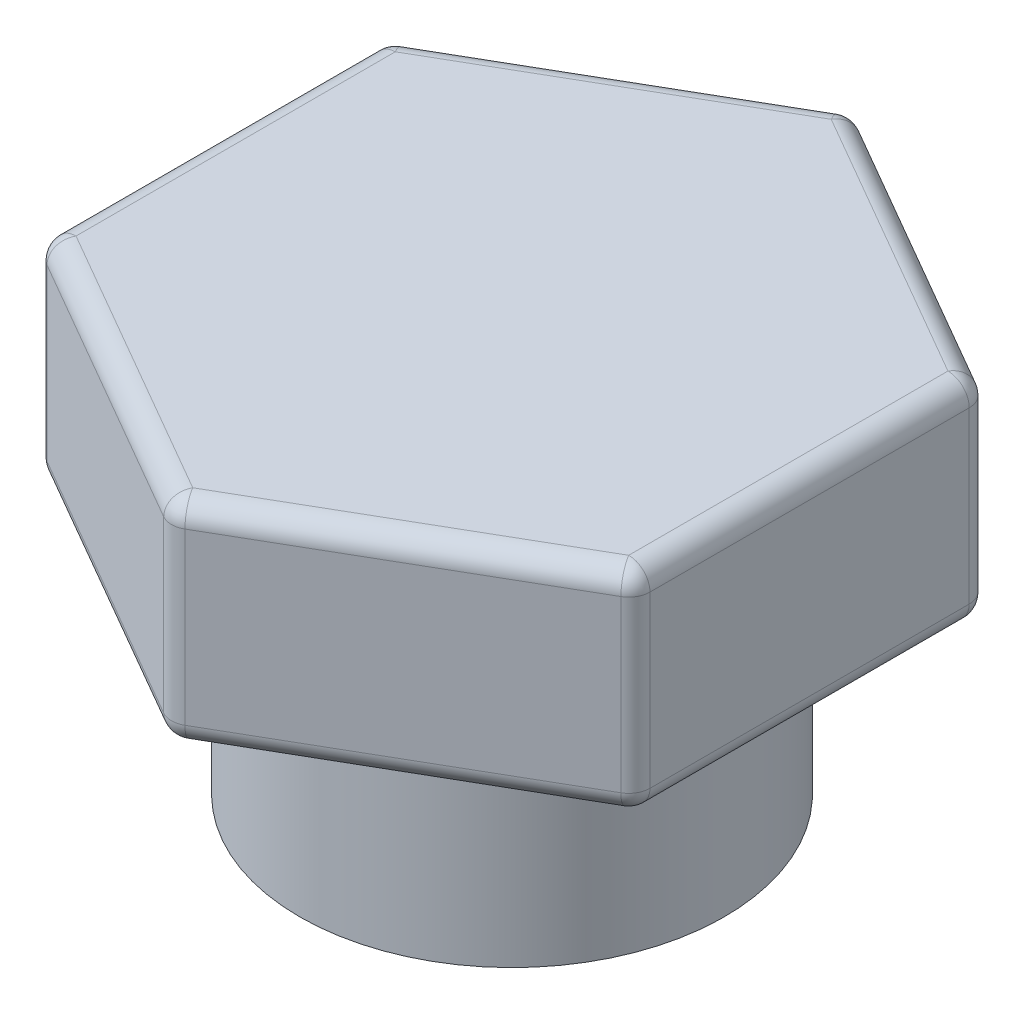
ISO-10303-21;
HEADER;
FILE_DESCRIPTION(('STEP AP214'),'2;1');
FILE_NAME('part.step','',(''),(''),'','','');
FILE_SCHEMA(('AUTOMOTIVE_DESIGN { 1 0 10303 214 1 1 1 1 }'));
ENDSEC;
DATA;
#1=APPLICATION_CONTEXT('core data for automotive mechanical design processes');
#2=APPLICATION_PROTOCOL_DEFINITION('international standard','automotive_design',2000,#1);
#3=PRODUCT_CONTEXT('',#1,'mechanical');
#4=PRODUCT('Part','Part','',(#3));
#5=PRODUCT_RELATED_PRODUCT_CATEGORY('part','',(#4));
#6=PRODUCT_DEFINITION_FORMATION('','',#4);
#7=PRODUCT_DEFINITION_CONTEXT('part definition',#1,'design');
#8=PRODUCT_DEFINITION('design','',#6,#7);
#9=PRODUCT_DEFINITION_SHAPE('','',#8);
#10=(LENGTH_UNIT() NAMED_UNIT(*) SI_UNIT(.MILLI.,.METRE.));
#11=(NAMED_UNIT(*) PLANE_ANGLE_UNIT() SI_UNIT($,.RADIAN.));
#12=(NAMED_UNIT(*) SI_UNIT($,.STERADIAN.) SOLID_ANGLE_UNIT());
#13=UNCERTAINTY_MEASURE_WITH_UNIT(LENGTH_MEASURE(1.E-05),#10,'distance_accuracy_value','');
#14=(GEOMETRIC_REPRESENTATION_CONTEXT(3) GLOBAL_UNCERTAINTY_ASSIGNED_CONTEXT((#13)) GLOBAL_UNIT_ASSIGNED_CONTEXT((#10,
#11,#12)) REPRESENTATION_CONTEXT('',''));
#15=CARTESIAN_POINT('',(0.,0.,0.));
#16=DIRECTION('',(0.,0.,1.));
#17=DIRECTION('',(1.,0.,0.));
#18=AXIS2_PLACEMENT_3D('',#15,#16,#17);
#19=CARTESIAN_POINT('',(0.,5.,0.));
#20=DIRECTION('',(0.,-1.,0.));
#21=DIRECTION('',(0.,0.,-1.));
#22=AXIS2_PLACEMENT_3D('',#19,#20,#21);
#23=CYLINDRICAL_SURFACE('',#22,5.);
#24=CARTESIAN_POINT('',(0.,5.,0.));
#25=DIRECTION('',(0.,1.,0.));
#26=DIRECTION('',(0.,0.,1.));
#27=AXIS2_PLACEMENT_3D('',#24,#25,#26);
#28=CIRCLE('',#27,5.);
#29=CARTESIAN_POINT('',(0.,5.,5.));
#30=VERTEX_POINT('',#29);
#31=EDGE_CURVE('E195',#30,#30,#28,.T.);
#32=ORIENTED_EDGE('',*,*,#31,.F.);
#33=EDGE_LOOP('',(#32));
#34=FACE_BOUND('',#33,.T.);
#35=CARTESIAN_POINT('',(0.,0.,0.));
#36=DIRECTION('',(0.,1.,0.));
#37=DIRECTION('',(0.,0.,1.));
#38=AXIS2_PLACEMENT_3D('',#35,#36,#37);
#39=CIRCLE('',#38,5.);
#40=CARTESIAN_POINT('',(0.,0.,5.));
#41=VERTEX_POINT('',#40);
#42=EDGE_CURVE('E352',#41,#41,#39,.T.);
#43=ORIENTED_EDGE('',*,*,#42,.T.);
#44=EDGE_LOOP('',(#43));
#45=FACE_BOUND('',#44,.T.);
#46=ADVANCED_FACE('F39',(#34,#45),#23,.T.);
#47=CARTESIAN_POINT('',(0.,0.,0.));
#48=DIRECTION('',(0.,1.,0.));
#49=DIRECTION('',(0.,0.,1.));
#50=AXIS2_PLACEMENT_3D('',#47,#48,#49);
#51=PLANE('',#50);
#52=ORIENTED_EDGE('',*,*,#42,.F.);
#53=EDGE_LOOP('',(#52));
#54=FACE_BOUND('',#53,.T.);
#55=ADVANCED_FACE('F452',(#54),#51,.F.);
#56=CARTESIAN_POINT('',(-0.00203099074300272,10.,8.0890769934766));
#57=DIRECTION('',(-0.499782544163119,0.,-0.866150915574093));
#58=DIRECTION('',(-0.866150915574093,0.,0.499782544163119));
#59=AXIS2_PLACEMENT_3D('',#56,#57,#58);
#60=PLANE('',#59);
#61=DIRECTION('',(0.,-1.,0.));
#62=VECTOR('',#61,1.);
#63=CARTESIAN_POINT('',(6.75429444201471,10.,4.19057217952102));
#64=LINE('',#63,#62);
#65=CARTESIAN_POINT('',(6.75429444201471,5.5,4.19057217952102));
#66=VERTEX_POINT('',#65);
#67=CARTESIAN_POINT('',(6.75429444201471,9.5,4.19057217952102));
#68=VERTEX_POINT('',#67);
#69=EDGE_CURVE('E227',#66,#68,#64,.F.);
#70=ORIENTED_EDGE('',*,*,#69,.T.);
#71=DIRECTION('',(0.866150915574093,0.,-0.499782544163119));
#72=VECTOR('',#71,1.);
#73=CARTESIAN_POINT('',(-0.00203099074300331,9.5,8.0890769934766));
#74=LINE('',#73,#72);
#75=CARTESIAN_POINT('',(0.24800524138977,9.5,7.94480220027217));
#76=VERTEX_POINT('',#75);
#77=EDGE_CURVE('E226',#68,#76,#74,.F.);
#78=ORIENTED_EDGE('',*,*,#77,.T.);
#79=DIRECTION('',(0.,-1.,0.));
#80=VECTOR('',#79,1.);
#81=CARTESIAN_POINT('',(0.24800524138977,10.,7.94480220027217));
#82=LINE('',#81,#80);
#83=CARTESIAN_POINT('',(0.24800524138977,5.5,7.94480220027217));
#84=VERTEX_POINT('',#83);
#85=EDGE_CURVE('E221',#76,#84,#82,.T.);
#86=ORIENTED_EDGE('',*,*,#85,.T.);
#87=DIRECTION('',(0.866150915574093,0.,-0.499782544163119));
#88=VECTOR('',#87,1.);
#89=CARTESIAN_POINT('',(-0.00203099074300272,5.5,8.0890769934766));
#90=LINE('',#89,#88);
#91=EDGE_CURVE('E228',#84,#66,#90,.T.);
#92=ORIENTED_EDGE('',*,*,#91,.T.);
#93=EDGE_LOOP('',(#70,#78,#86,#92));
#94=FACE_BOUND('',#93,.T.);
#95=ADVANCED_FACE('F458',(#94),#60,.F.);
#96=CARTESIAN_POINT('',(7.00433067414748,10.,4.04629738631659));
#97=DIRECTION('',(-0.999999968479875,0.,-0.000251078173767648));
#98=DIRECTION('',(-0.000251078173767648,0.,0.999999968479875));
#99=AXIS2_PLACEMENT_3D('',#96,#97,#98);
#100=PLANE('',#99);
#101=DIRECTION('',(0.000251078173767648,0.,-0.999999968479875));
#102=VECTOR('',#101,1.);
#103=CARTESIAN_POINT('',(7.00433067414748,9.5,4.04629738631659));
#104=LINE('',#103,#102);
#105=CARTESIAN_POINT('',(7.00628918486488,9.5,-3.75410448166427));
#106=VERTEX_POINT('',#105);
#107=CARTESIAN_POINT('',(7.00440315417309,9.5,3.75762226082086));
#108=VERTEX_POINT('',#107);
#109=EDGE_CURVE('E173',#106,#108,#104,.F.);
#110=ORIENTED_EDGE('',*,*,#109,.T.);
#111=DIRECTION('',(0.,-1.,0.));
#112=VECTOR('',#111,1.);
#113=CARTESIAN_POINT('',(7.00440315417309,10.,3.75762226082086));
#114=LINE('',#113,#112);
#115=CARTESIAN_POINT('',(7.00440315417309,5.5,3.75762226082086));
#116=VERTEX_POINT('',#115);
#117=EDGE_CURVE('E207',#108,#116,#114,.T.);
#118=ORIENTED_EDGE('',*,*,#117,.T.);
#119=DIRECTION('',(0.000251078173767648,0.,-0.999999968479875));
#120=VECTOR('',#119,1.);
#121=CARTESIAN_POINT('',(7.00433067414748,5.5,4.04629738631659));
#122=LINE('',#121,#120);
#123=CARTESIAN_POINT('',(7.00628918486488,5.5,-3.75410448166427));
#124=VERTEX_POINT('',#123);
#125=EDGE_CURVE('E203',#116,#124,#122,.T.);
#126=ORIENTED_EDGE('',*,*,#125,.T.);
#127=DIRECTION('',(0.,-1.,0.));
#128=VECTOR('',#127,1.);
#129=CARTESIAN_POINT('',(7.00628918486488,10.,-3.75410448166427));
#130=LINE('',#129,#128);
#131=EDGE_CURVE('E200',#124,#106,#130,.F.);
#132=ORIENTED_EDGE('',*,*,#131,.T.);
#133=EDGE_LOOP('',(#110,#118,#126,#132));
#134=FACE_BOUND('',#133,.T.);
#135=ADVANCED_FACE('F392',(#134),#100,.F.);
#136=CARTESIAN_POINT('',(7.00636166489049,10.,-4.04277960716));
#137=DIRECTION('',(-0.500217424316756,0.,0.865899837400326));
#138=DIRECTION('',(0.865899837400326,0.,0.500217424316756));
#139=AXIS2_PLACEMENT_3D('',#136,#137,#138);
#140=PLANE('',#139);
#141=DIRECTION('',(-0.865899837400326,0.,-0.500217424316756));
#142=VECTOR('',#141,1.);
#143=CARTESIAN_POINT('',(7.00636166489049,9.5,-4.04277960716));
#144=LINE('',#143,#142);
#145=CARTESIAN_POINT('',(0.251994742850171,9.5,-7.94467666118529));
#146=VERTEX_POINT('',#145);
#147=CARTESIAN_POINT('',(6.75639791278332,9.5,-4.18717993945131));
#148=VERTEX_POINT('',#147);
#149=EDGE_CURVE('E48',#146,#148,#144,.F.);
#150=ORIENTED_EDGE('',*,*,#149,.T.);
#151=DIRECTION('',(0.,-1.,0.));
#152=VECTOR('',#151,1.);
#153=CARTESIAN_POINT('',(6.75639791278332,10.,-4.18717993945131));
#154=LINE('',#153,#152);
#155=CARTESIAN_POINT('',(6.75639791278332,5.5,-4.18717993945131));
#156=VERTEX_POINT('',#155);
#157=EDGE_CURVE('E11',#148,#156,#154,.T.);
#158=ORIENTED_EDGE('',*,*,#157,.T.);
#159=DIRECTION('',(-0.865899837400326,0.,-0.500217424316756));
#160=VECTOR('',#159,1.);
#161=CARTESIAN_POINT('',(7.00636166489049,5.5,-4.04277960716));
#162=LINE('',#161,#160);
#163=CARTESIAN_POINT('',(0.251994742850171,5.5,-7.94467666118529));
#164=VERTEX_POINT('',#163);
#165=EDGE_CURVE('E257',#156,#164,#162,.T.);
#166=ORIENTED_EDGE('',*,*,#165,.T.);
#167=DIRECTION('',(0.,-1.,0.));
#168=VECTOR('',#167,1.);
#169=CARTESIAN_POINT('',(0.25199474285017,10.,-7.94467666118529));
#170=LINE('',#169,#168);
#171=EDGE_CURVE('E56',#164,#146,#170,.F.);
#172=ORIENTED_EDGE('',*,*,#171,.T.);
#173=EDGE_LOOP('',(#150,#158,#166,#172));
#174=FACE_BOUND('',#173,.T.);
#175=ADVANCED_FACE('F397',(#174),#140,.F.);
#176=CARTESIAN_POINT('',(0.00203099074300591,10.,-8.0890769934766));
#177=DIRECTION('',(0.499782544163119,0.,0.866150915574094));
#178=DIRECTION('',(0.866150915574094,0.,-0.499782544163119));
#179=AXIS2_PLACEMENT_3D('',#176,#177,#178);
#180=PLANE('',#179);
#181=DIRECTION('',(0.,-1.,0.));
#182=VECTOR('',#181,1.);
#183=CARTESIAN_POINT('',(-6.75429444201471,10.,-4.19057217952102));
#184=LINE('',#183,#182);
#185=CARTESIAN_POINT('',(-6.75429444201471,5.5,-4.19057217952102));
#186=VERTEX_POINT('',#185);
#187=CARTESIAN_POINT('',(-6.75429444201471,9.5,-4.19057217952102));
#188=VERTEX_POINT('',#187);
#189=EDGE_CURVE('E254',#186,#188,#184,.F.);
#190=ORIENTED_EDGE('',*,*,#189,.T.);
#191=DIRECTION('',(-0.866150915574094,0.,0.499782544163119));
#192=VECTOR('',#191,1.);
#193=CARTESIAN_POINT('',(0.00203099074300631,9.5,-8.0890769934766));
#194=LINE('',#193,#192);
#195=CARTESIAN_POINT('',(-0.248005241389767,9.5,-7.94480220027217));
#196=VERTEX_POINT('',#195);
#197=EDGE_CURVE('E260',#188,#196,#194,.F.);
#198=ORIENTED_EDGE('',*,*,#197,.T.);
#199=DIRECTION('',(0.,-1.,0.));
#200=VECTOR('',#199,1.);
#201=CARTESIAN_POINT('',(-0.248005241389767,10.,-7.94480220027217));
#202=LINE('',#201,#200);
#203=CARTESIAN_POINT('',(-0.248005241389767,5.5,-7.94480220027217));
#204=VERTEX_POINT('',#203);
#205=EDGE_CURVE('E253',#196,#204,#202,.T.);
#206=ORIENTED_EDGE('',*,*,#205,.T.);
#207=DIRECTION('',(-0.866150915574094,0.,0.499782544163119));
#208=VECTOR('',#207,1.);
#209=CARTESIAN_POINT('',(0.00203099074300591,5.5,-8.0890769934766));
#210=LINE('',#209,#208);
#211=EDGE_CURVE('E251',#204,#186,#210,.T.);
#212=ORIENTED_EDGE('',*,*,#211,.T.);
#213=EDGE_LOOP('',(#190,#198,#206,#212));
#214=FACE_BOUND('',#213,.T.);
#215=ADVANCED_FACE('F735',(#214),#180,.F.);
#216=CARTESIAN_POINT('',(-7.00433067414748,10.,-4.0462973863166));
#217=DIRECTION('',(0.999999968479875,0.,0.000251078173767863));
#218=DIRECTION('',(0.000251078173767863,0.,-0.999999968479875));
#219=AXIS2_PLACEMENT_3D('',#216,#217,#218);
#220=PLANE('',#219);
#221=DIRECTION('',(0.,-1.,0.));
#222=VECTOR('',#221,1.);
#223=CARTESIAN_POINT('',(-7.00628918486488,10.,3.75410448166427));
#224=LINE('',#223,#222);
#225=CARTESIAN_POINT('',(-7.00628918486488,5.5,3.75410448166426));
#226=VERTEX_POINT('',#225);
#227=CARTESIAN_POINT('',(-7.00628918486488,9.5,3.75410448166426));
#228=VERTEX_POINT('',#227);
#229=EDGE_CURVE('E247',#226,#228,#224,.F.);
#230=ORIENTED_EDGE('',*,*,#229,.T.);
#231=DIRECTION('',(-0.000251078173767863,0.,0.999999968479875));
#232=VECTOR('',#231,1.);
#233=CARTESIAN_POINT('',(-7.00433067414748,9.5,-4.0462973863166));
#234=LINE('',#233,#232);
#235=CARTESIAN_POINT('',(-7.00440315417309,9.5,-3.75762226082086));
#236=VERTEX_POINT('',#235);
#237=EDGE_CURVE('E250',#228,#236,#234,.F.);
#238=ORIENTED_EDGE('',*,*,#237,.T.);
#239=DIRECTION('',(0.,-1.,0.));
#240=VECTOR('',#239,1.);
#241=CARTESIAN_POINT('',(-7.00440315417309,10.,-3.75762226082086));
#242=LINE('',#241,#240);
#243=CARTESIAN_POINT('',(-7.00440315417309,5.5,-3.75762226082086));
#244=VERTEX_POINT('',#243);
#245=EDGE_CURVE('E244',#236,#244,#242,.T.);
#246=ORIENTED_EDGE('',*,*,#245,.T.);
#247=DIRECTION('',(-0.000251078173767863,0.,0.999999968479875));
#248=VECTOR('',#247,1.);
#249=CARTESIAN_POINT('',(-7.00433067414748,5.5,-4.0462973863166));
#250=LINE('',#249,#248);
#251=EDGE_CURVE('E245',#244,#226,#250,.T.);
#252=ORIENTED_EDGE('',*,*,#251,.T.);
#253=EDGE_LOOP('',(#230,#238,#246,#252));
#254=FACE_BOUND('',#253,.T.);
#255=ADVANCED_FACE('F432',(#254),#220,.F.);
#256=CARTESIAN_POINT('',(-7.00636166489049,10.,4.04277960716));
#257=DIRECTION('',(0.500217424316756,0.,-0.865899837400326));
#258=DIRECTION('',(-0.865899837400326,0.,-0.500217424316756));
#259=AXIS2_PLACEMENT_3D('',#256,#257,#258);
#260=PLANE('',#259);
#261=DIRECTION('',(0.,-1.,0.));
#262=VECTOR('',#261,1.);
#263=CARTESIAN_POINT('',(-0.251994742850168,10.,7.94467666118529));
#264=LINE('',#263,#262);
#265=CARTESIAN_POINT('',(-0.251994742850168,5.5,7.94467666118529));
#266=VERTEX_POINT('',#265);
#267=CARTESIAN_POINT('',(-0.251994742850168,9.5,7.94467666118529));
#268=VERTEX_POINT('',#267);
#269=EDGE_CURVE('E240',#266,#268,#264,.F.);
#270=ORIENTED_EDGE('',*,*,#269,.T.);
#271=DIRECTION('',(0.865899837400326,0.,0.500217424316756));
#272=VECTOR('',#271,1.);
#273=CARTESIAN_POINT('',(-7.00636166489049,9.5,4.04277960716));
#274=LINE('',#273,#272);
#275=CARTESIAN_POINT('',(-6.75639791278332,9.5,4.18717993945131));
#276=VERTEX_POINT('',#275);
#277=EDGE_CURVE('E239',#268,#276,#274,.F.);
#278=ORIENTED_EDGE('',*,*,#277,.T.);
#279=DIRECTION('',(0.,-1.,0.));
#280=VECTOR('',#279,1.);
#281=CARTESIAN_POINT('',(-6.75639791278332,10.,4.18717993945131));
#282=LINE('',#281,#280);
#283=CARTESIAN_POINT('',(-6.75639791278332,5.5,4.18717993945131));
#284=VERTEX_POINT('',#283);
#285=EDGE_CURVE('E231',#276,#284,#282,.T.);
#286=ORIENTED_EDGE('',*,*,#285,.T.);
#287=DIRECTION('',(0.865899837400326,0.,0.500217424316756));
#288=VECTOR('',#287,1.);
#289=CARTESIAN_POINT('',(-7.00636166489049,5.5,4.04277960716));
#290=LINE('',#289,#288);
#291=EDGE_CURVE('E234',#284,#266,#290,.T.);
#292=ORIENTED_EDGE('',*,*,#291,.T.);
#293=EDGE_LOOP('',(#270,#278,#286,#292));
#294=FACE_BOUND('',#293,.T.);
#295=ADVANCED_FACE('F717',(#294),#260,.F.);
#296=CARTESIAN_POINT('',(0.,10.,0.));
#297=DIRECTION('',(0.,1.,0.));
#298=DIRECTION('',(0.,0.,1.));
#299=AXIS2_PLACEMENT_3D('',#296,#297,#298);
#300=PLANE('',#299);
#301=DIRECTION('',(0.866150915574093,0.,-0.499782544163119));
#302=VECTOR('',#301,1.);
#303=CARTESIAN_POINT('',(6.75443940206592,10.,3.61322192852955));
#304=LINE('',#303,#302);
#305=CARTESIAN_POINT('',(-0.00188603069178939,10.,7.51172674248513));
#306=VERTEX_POINT('',#305);
#307=CARTESIAN_POINT('',(6.50440316993315,10.,3.75749672173397));
#308=VERTEX_POINT('',#307);
#309=EDGE_CURVE('E197',#306,#308,#304,.T.);
#310=ORIENTED_EDGE('',*,*,#309,.T.);
#311=DIRECTION('',(0.000251078173767648,0.,-0.999999968479875));
#312=VECTOR('',#311,1.);
#313=CARTESIAN_POINT('',(6.50636168065055,10.,-4.04290514624689));
#314=LINE('',#313,#312);
#315=CARTESIAN_POINT('',(6.50628920062494,10.,-3.75423002075115));
#316=VERTEX_POINT('',#315);
#317=EDGE_CURVE('E166',#308,#316,#314,.T.);
#318=ORIENTED_EDGE('',*,*,#317,.T.);
#319=DIRECTION('',(-0.865899837400326,0.,-0.500217424316756));
#320=VECTOR('',#319,1.);
#321=CARTESIAN_POINT('',(-0.248077721415373,10.,-7.65612707477644));
#322=LINE('',#321,#320);
#323=CARTESIAN_POINT('',(0.00188603069179157,10.,-7.51172674248513));
#324=VERTEX_POINT('',#323);
#325=EDGE_CURVE('E188',#316,#324,#322,.T.);
#326=ORIENTED_EDGE('',*,*,#325,.T.);
#327=DIRECTION('',(-0.866150915574094,0.,0.499782544163119));
#328=VECTOR('',#327,1.);
#329=CARTESIAN_POINT('',(-6.75443940206592,10.,-3.61322192852955));
#330=LINE('',#329,#328);
#331=CARTESIAN_POINT('',(-6.50440316993315,10.,-3.75749672173398));
#332=VERTEX_POINT('',#331);
#333=EDGE_CURVE('E194',#324,#332,#330,.T.);
#334=ORIENTED_EDGE('',*,*,#333,.T.);
#335=DIRECTION('',(-0.000251078173767863,0.,0.999999968479875));
#336=VECTOR('',#335,1.);
#337=CARTESIAN_POINT('',(-6.50636168065055,10.,4.04290514624689));
#338=LINE('',#337,#336);
#339=CARTESIAN_POINT('',(-6.50628920062494,10.,3.75423002075115));
#340=VERTEX_POINT('',#339);
#341=EDGE_CURVE('E368',#332,#340,#338,.T.);
#342=ORIENTED_EDGE('',*,*,#341,.T.);
#343=DIRECTION('',(0.865899837400326,0.,0.500217424316756));
#344=VECTOR('',#343,1.);
#345=CARTESIAN_POINT('',(0.248077721415375,10.,7.65612707477643));
#346=LINE('',#345,#344);
#347=EDGE_CURVE('E201',#340,#306,#346,.T.);
#348=ORIENTED_EDGE('',*,*,#347,.T.);
#349=EDGE_LOOP('',(#310,#318,#326,#334,#342,#348));
#350=FACE_BOUND('',#349,.T.);
#351=ADVANCED_FACE('F193',(#350),#300,.T.);
#352=CARTESIAN_POINT('',(0.,5.,0.));
#353=DIRECTION('',(0.,1.,0.));
#354=DIRECTION('',(0.,0.,1.));
#355=AXIS2_PLACEMENT_3D('',#352,#353,#354);
#356=PLANE('',#355);
#357=DIRECTION('',(-0.865899837400326,0.,-0.500217424316756));
#358=VECTOR('',#357,1.);
#359=CARTESIAN_POINT('',(3.25408761565837,5.,-5.63297838161814));
#360=LINE('',#359,#358);
#361=CARTESIAN_POINT('',(0.00188603069179265,5.,-7.51172674248513));
#362=VERTEX_POINT('',#361);
#363=CARTESIAN_POINT('',(6.50628920062494,5.,-3.75423002075115));
#364=VERTEX_POINT('',#363);
#365=EDGE_CURVE('E211',#362,#364,#360,.F.);
#366=ORIENTED_EDGE('',*,*,#365,.T.);
#367=DIRECTION('',(0.000251078173767648,0.,-0.999999968479875));
#368=VECTOR('',#367,1.);
#369=CARTESIAN_POINT('',(6.50534618527905,5.,0.00163335049140961));
#370=LINE('',#369,#368);
#371=CARTESIAN_POINT('',(6.50440316993315,5.,3.75749672173397));
#372=VERTEX_POINT('',#371);
#373=EDGE_CURVE('E222',#364,#372,#370,.F.);
#374=ORIENTED_EDGE('',*,*,#373,.T.);
#375=DIRECTION('',(0.866150915574093,0.,-0.499782544163119));
#376=VECTOR('',#375,1.);
#377=CARTESIAN_POINT('',(3.25125856962068,5.,5.63461173210955));
#378=LINE('',#377,#376);
#379=CARTESIAN_POINT('',(-0.00188603069178967,5.,7.51172674248513));
#380=VERTEX_POINT('',#379);
#381=EDGE_CURVE('E218',#372,#380,#378,.F.);
#382=ORIENTED_EDGE('',*,*,#381,.T.);
#383=DIRECTION('',(0.865899837400326,0.,0.500217424316756));
#384=VECTOR('',#383,1.);
#385=CARTESIAN_POINT('',(-3.25408761565837,5.,5.63297838161813));
#386=LINE('',#385,#384);
#387=CARTESIAN_POINT('',(-6.50628920062494,5.,3.75423002075115));
#388=VERTEX_POINT('',#387);
#389=EDGE_CURVE('E220',#380,#388,#386,.F.);
#390=ORIENTED_EDGE('',*,*,#389,.T.);
#391=DIRECTION('',(-0.000251078173767863,0.,0.999999968479875));
#392=VECTOR('',#391,1.);
#393=CARTESIAN_POINT('',(-6.50534618527904,5.,-0.00163335049141101));
#394=LINE('',#393,#392);
#395=CARTESIAN_POINT('',(-6.50440316993315,5.,-3.75749672173398));
#396=VERTEX_POINT('',#395);
#397=EDGE_CURVE('E214',#388,#396,#394,.F.);
#398=ORIENTED_EDGE('',*,*,#397,.T.);
#399=DIRECTION('',(-0.866150915574094,0.,0.499782544163119));
#400=VECTOR('',#399,1.);
#401=CARTESIAN_POINT('',(-3.25125856962068,5.,-5.63461173210955));
#402=LINE('',#401,#400);
#403=EDGE_CURVE('E213',#396,#362,#402,.F.);
#404=ORIENTED_EDGE('',*,*,#403,.T.);
#405=EDGE_LOOP('',(#366,#374,#382,#390,#398,#404));
#406=FACE_BOUND('',#405,.T.);
#407=ORIENTED_EDGE('',*,*,#31,.T.);
#408=EDGE_LOOP('',(#407));
#409=FACE_BOUND('',#408,.T.);
#410=ADVANCED_FACE('F697',(#406,#409),#356,.F.);
#411=CARTESIAN_POINT('',(-6.50433068990754,5.5,-4.04617184722971));
#412=DIRECTION('',(-0.000251078173767863,0.,0.999999968479875));
#413=DIRECTION('',(0.999999968479875,0.,0.000251078173767863));
#414=AXIS2_PLACEMENT_3D('',#411,#412,#413);
#415=CYLINDRICAL_SURFACE('',#414,0.5);
#416=CARTESIAN_POINT('',(-6.50628920062494,5.5,3.75423002075115));
#417=DIRECTION('',(-0.00025107817376753,0.,0.999999968479875));
#418=DIRECTION('',(0.999999968479875,0.,0.00025107817376753));
#419=AXIS2_PLACEMENT_3D('',#416,#417,#418);
#420=CIRCLE('',#419,0.5);
#421=EDGE_CURVE('E43',#226,#388,#420,.T.);
#422=ORIENTED_EDGE('',*,*,#421,.F.);
#423=ORIENTED_EDGE('',*,*,#251,.F.);
#424=CARTESIAN_POINT('',(-6.50440316993315,5.5,-3.75749672173398));
#425=DIRECTION('',(0.000251078173768397,0.,-0.999999968479875));
#426=DIRECTION('',(-0.999999968479875,0.,-0.000251078173768397));
#427=AXIS2_PLACEMENT_3D('',#424,#425,#426);
#428=CIRCLE('',#427,0.5);
#429=EDGE_CURVE('E347',#396,#244,#428,.T.);
#430=ORIENTED_EDGE('',*,*,#429,.F.);
#431=ORIENTED_EDGE('',*,*,#397,.F.);
#432=EDGE_LOOP('',(#422,#423,#430,#431));
#433=FACE_BOUND('',#432,.T.);
#434=ADVANCED_FACE('F41',(#433),#415,.T.);
#435=CARTESIAN_POINT('',(-6.50628920062494,5.5,3.75423002075115));
#436=DIRECTION('',(0.,-1.,0.));
#437=DIRECTION('',(0.,0.,-1.));
#438=AXIS2_PLACEMENT_3D('',#435,#436,#437);
#439=SPHERICAL_SURFACE('',#438,0.5);
#440=CARTESIAN_POINT('',(-6.50628920062494,5.5,3.75423002075115));
#441=DIRECTION('',(0.,-1.,0.));
#442=DIRECTION('',(0.,0.,-1.));
#443=AXIS2_PLACEMENT_3D('',#440,#441,#442);
#444=CIRCLE('',#443,0.5);
#445=EDGE_CURVE('E343',#226,#284,#444,.F.);
#446=ORIENTED_EDGE('',*,*,#445,.F.);
#447=ORIENTED_EDGE('',*,*,#421,.T.);
#448=CARTESIAN_POINT('',(-6.50628920062494,5.5,3.75423002075115));
#449=DIRECTION('',(-0.865899837400326,0.,-0.500217424316756));
#450=DIRECTION('',(-0.500217424316756,0.,0.865899837400326));
#451=AXIS2_PLACEMENT_3D('',#448,#449,#450);
#452=CIRCLE('',#451,0.5);
#453=EDGE_CURVE('E342',#284,#388,#452,.F.);
#454=ORIENTED_EDGE('',*,*,#453,.F.);
#455=EDGE_LOOP('',(#446,#447,#454));
#456=FACE_BOUND('',#455,.T.);
#457=ADVANCED_FACE('F687',(#456),#439,.T.);
#458=CARTESIAN_POINT('',(-6.50440316993315,5.5,-3.75749672173398));
#459=DIRECTION('',(0.,-1.,0.));
#460=DIRECTION('',(0.,0.,-1.));
#461=AXIS2_PLACEMENT_3D('',#458,#459,#460);
#462=SPHERICAL_SURFACE('',#461,0.5);
#463=CARTESIAN_POINT('',(-6.50440316993315,5.5,-3.75749672173398));
#464=DIRECTION('',(-0.866150915574094,0.,0.499782544163118));
#465=DIRECTION('',(0.499782544163118,0.,0.866150915574094));
#466=AXIS2_PLACEMENT_3D('',#463,#464,#465);
#467=CIRCLE('',#466,0.5);
#468=EDGE_CURVE('E333',#396,#186,#467,.F.);
#469=ORIENTED_EDGE('',*,*,#468,.F.);
#470=ORIENTED_EDGE('',*,*,#429,.T.);
#471=CARTESIAN_POINT('',(-6.50440316993315,5.5,-3.75749672173398));
#472=DIRECTION('',(0.,-1.,0.));
#473=DIRECTION('',(0.,0.,-1.));
#474=AXIS2_PLACEMENT_3D('',#471,#472,#473);
#475=CIRCLE('',#474,0.5);
#476=EDGE_CURVE('E337',#186,#244,#475,.F.);
#477=ORIENTED_EDGE('',*,*,#476,.F.);
#478=EDGE_LOOP('',(#469,#470,#477));
#479=FACE_BOUND('',#478,.T.);
#480=ADVANCED_FACE('F680',(#479),#462,.T.);
#481=CARTESIAN_POINT('',(-6.75625295273211,5.5,3.60982968845984));
#482=DIRECTION('',(0.865899837400326,0.,0.500217424316756));
#483=DIRECTION('',(0.500217424316756,0.,-0.865899837400326));
#484=AXIS2_PLACEMENT_3D('',#481,#482,#483);
#485=CYLINDRICAL_SURFACE('',#484,0.5);
#486=ORIENTED_EDGE('',*,*,#453,.T.);
#487=ORIENTED_EDGE('',*,*,#389,.F.);
#488=CARTESIAN_POINT('',(-0.00188603069178981,5.5,7.51172674248513));
#489=DIRECTION('',(0.865899837400326,0.,0.500217424316756));
#490=DIRECTION('',(0.500217424316756,0.,-0.865899837400326));
#491=AXIS2_PLACEMENT_3D('',#488,#489,#490);
#492=CIRCLE('',#491,0.5);
#493=EDGE_CURVE('E335',#266,#380,#492,.T.);
#494=ORIENTED_EDGE('',*,*,#493,.F.);
#495=ORIENTED_EDGE('',*,*,#291,.F.);
#496=EDGE_LOOP('',(#486,#487,#494,#495));
#497=FACE_BOUND('',#496,.T.);
#498=ADVANCED_FACE('F670',(#497),#485,.T.);
#499=CARTESIAN_POINT('',(-6.50628920062494,10.,3.75423002075115));
#500=DIRECTION('',(0.,-1.,0.));
#501=DIRECTION('',(0.,0.,-1.));
#502=AXIS2_PLACEMENT_3D('',#499,#500,#501);
#503=CYLINDRICAL_SURFACE('',#502,0.5);
#504=ORIENTED_EDGE('',*,*,#445,.T.);
#505=ORIENTED_EDGE('',*,*,#285,.F.);
#506=CARTESIAN_POINT('',(-6.50628920062494,9.5,3.75423002075115));
#507=DIRECTION('',(0.,1.,0.));
#508=DIRECTION('',(0.,0.,1.));
#509=AXIS2_PLACEMENT_3D('',#506,#507,#508);
#510=CIRCLE('',#509,0.5);
#511=EDGE_CURVE('E328',#228,#276,#510,.T.);
#512=ORIENTED_EDGE('',*,*,#511,.F.);
#513=ORIENTED_EDGE('',*,*,#229,.F.);
#514=EDGE_LOOP('',(#504,#505,#512,#513));
#515=FACE_BOUND('',#514,.T.);
#516=ADVANCED_FACE('F438',(#515),#503,.T.);
#517=CARTESIAN_POINT('',(-6.50534618527904,9.5,-0.00163335049141101));
#518=DIRECTION('',(0.000251078173767863,0.,-0.999999968479875));
#519=DIRECTION('',(-0.999999968479875,0.,-0.000251078173767863));
#520=AXIS2_PLACEMENT_3D('',#517,#518,#519);
#521=CYLINDRICAL_SURFACE('',#520,0.5);
#522=CARTESIAN_POINT('',(-6.50440316993315,9.5,-3.75749672173398));
#523=DIRECTION('',(0.00025107817376753,0.,-0.999999968479875));
#524=DIRECTION('',(-0.999999968479875,0.,-0.00025107817376753));
#525=AXIS2_PLACEMENT_3D('',#522,#523,#524);
#526=CIRCLE('',#525,0.5);
#527=EDGE_CURVE('E323',#236,#332,#526,.T.);
#528=ORIENTED_EDGE('',*,*,#527,.F.);
#529=ORIENTED_EDGE('',*,*,#237,.F.);
#530=CARTESIAN_POINT('',(-6.50628920062494,9.5,3.75423002075115));
#531=DIRECTION('',(-0.00025107817376753,0.,0.999999968479875));
#532=DIRECTION('',(0.999999968479875,0.,0.00025107817376753));
#533=AXIS2_PLACEMENT_3D('',#530,#531,#532);
#534=CIRCLE('',#533,0.5);
#535=EDGE_CURVE('E326',#340,#228,#534,.T.);
#536=ORIENTED_EDGE('',*,*,#535,.F.);
#537=ORIENTED_EDGE('',*,*,#341,.F.);
#538=EDGE_LOOP('',(#528,#529,#536,#537));
#539=FACE_BOUND('',#538,.T.);
#540=ADVANCED_FACE('F425',(#539),#521,.T.);
#541=CARTESIAN_POINT('',(-6.50440316993315,10.,-3.75749672173398));
#542=DIRECTION('',(0.,-1.,0.));
#543=DIRECTION('',(0.,0.,-1.));
#544=AXIS2_PLACEMENT_3D('',#541,#542,#543);
#545=CYLINDRICAL_SURFACE('',#544,0.5);
#546=ORIENTED_EDGE('',*,*,#476,.T.);
#547=ORIENTED_EDGE('',*,*,#245,.F.);
#548=CARTESIAN_POINT('',(-6.50440316993315,9.5,-3.75749672173398));
#549=DIRECTION('',(0.,1.,0.));
#550=DIRECTION('',(0.,0.,1.));
#551=AXIS2_PLACEMENT_3D('',#548,#549,#550);
#552=CIRCLE('',#551,0.5);
#553=EDGE_CURVE('E321',#188,#236,#552,.T.);
#554=ORIENTED_EDGE('',*,*,#553,.F.);
#555=ORIENTED_EDGE('',*,*,#189,.F.);
#556=EDGE_LOOP('',(#546,#547,#554,#555));
#557=FACE_BOUND('',#556,.T.);
#558=ADVANCED_FACE('F431',(#557),#545,.T.);
#559=CARTESIAN_POINT('',(0.251922262824565,5.5,-7.65600153568955));
#560=DIRECTION('',(-0.866150915574094,0.,0.499782544163119));
#561=DIRECTION('',(0.499782544163119,0.,0.866150915574094));
#562=AXIS2_PLACEMENT_3D('',#559,#560,#561);
#563=CYLINDRICAL_SURFACE('',#562,0.5);
#564=ORIENTED_EDGE('',*,*,#468,.T.);
#565=ORIENTED_EDGE('',*,*,#211,.F.);
#566=CARTESIAN_POINT('',(0.00188603069179287,5.5,-7.51172674248513));
#567=DIRECTION('',(0.866150915574093,0.,-0.49978254416312));
#568=DIRECTION('',(-0.49978254416312,0.,-0.866150915574093));
#569=AXIS2_PLACEMENT_3D('',#566,#567,#568);
#570=CIRCLE('',#569,0.5);
#571=EDGE_CURVE('E318',#362,#204,#570,.T.);
#572=ORIENTED_EDGE('',*,*,#571,.F.);
#573=ORIENTED_EDGE('',*,*,#403,.F.);
#574=EDGE_LOOP('',(#564,#565,#572,#573));
#575=FACE_BOUND('',#574,.T.);
#576=ADVANCED_FACE('F446',(#575),#563,.T.);
#577=CARTESIAN_POINT('',(-0.00188603069178945,5.5,7.51172674248512));
#578=DIRECTION('',(0.,-1.,0.));
#579=DIRECTION('',(0.,0.,-1.));
#580=AXIS2_PLACEMENT_3D('',#577,#578,#579);
#581=SPHERICAL_SURFACE('',#580,0.5);
#582=CARTESIAN_POINT('',(-0.00188603069178954,5.5,7.51172674248512));
#583=DIRECTION('',(0.,-1.,0.));
#584=DIRECTION('',(0.,0.,-1.));
#585=AXIS2_PLACEMENT_3D('',#582,#583,#584);
#586=CIRCLE('',#585,0.5);
#587=EDGE_CURVE('E315',#266,#84,#586,.F.);
#588=ORIENTED_EDGE('',*,*,#587,.F.);
#589=ORIENTED_EDGE('',*,*,#493,.T.);
#590=CARTESIAN_POINT('',(-0.00188603069178924,5.5,7.51172674248512));
#591=DIRECTION('',(-0.866150915574093,0.,0.499782544163119));
#592=DIRECTION('',(0.499782544163119,0.,0.866150915574093));
#593=AXIS2_PLACEMENT_3D('',#590,#591,#592);
#594=CIRCLE('',#593,0.5);
#595=EDGE_CURVE('E312',#84,#380,#594,.F.);
#596=ORIENTED_EDGE('',*,*,#595,.F.);
#597=EDGE_LOOP('',(#588,#589,#596));
#598=FACE_BOUND('',#597,.T.);
#599=ADVANCED_FACE('F444',(#598),#581,.T.);
#600=CARTESIAN_POINT('',(-6.50628920062494,9.5,3.75423002075115));
#601=DIRECTION('',(0.,1.,0.));
#602=DIRECTION('',(0.,0.,1.));
#603=AXIS2_PLACEMENT_3D('',#600,#601,#602);
#604=SPHERICAL_SURFACE('',#603,0.5);
#605=ORIENTED_EDGE('',*,*,#535,.T.);
#606=ORIENTED_EDGE('',*,*,#511,.T.);
#607=CARTESIAN_POINT('',(-6.50628920062494,9.5,3.75423002075115));
#608=DIRECTION('',(-0.865899837400326,0.,-0.500217424316756));
#609=DIRECTION('',(-0.500217424316756,0.,0.865899837400326));
#610=AXIS2_PLACEMENT_3D('',#607,#608,#609);
#611=CIRCLE('',#610,0.5);
#612=EDGE_CURVE('E309',#340,#276,#611,.F.);
#613=ORIENTED_EDGE('',*,*,#612,.F.);
#614=EDGE_LOOP('',(#605,#606,#613));
#615=FACE_BOUND('',#614,.T.);
#616=ADVANCED_FACE('F442',(#615),#604,.T.);
#617=CARTESIAN_POINT('',(-6.50440316993315,9.5,-3.75749672173398));
#618=DIRECTION('',(0.,1.,0.));
#619=DIRECTION('',(0.,0.,1.));
#620=AXIS2_PLACEMENT_3D('',#617,#618,#619);
#621=SPHERICAL_SURFACE('',#620,0.5);
#622=ORIENTED_EDGE('',*,*,#553,.T.);
#623=ORIENTED_EDGE('',*,*,#527,.T.);
#624=CARTESIAN_POINT('',(-6.50440316993315,9.5,-3.75749672173398));
#625=DIRECTION('',(-0.866150915574093,0.,0.499782544163119));
#626=DIRECTION('',(0.499782544163119,0.,0.866150915574093));
#627=AXIS2_PLACEMENT_3D('',#624,#625,#626);
#628=CIRCLE('',#627,0.5);
#629=EDGE_CURVE('E307',#188,#332,#628,.F.);
#630=ORIENTED_EDGE('',*,*,#629,.F.);
#631=EDGE_LOOP('',(#622,#623,#630));
#632=FACE_BOUND('',#631,.T.);
#633=ADVANCED_FACE('F430',(#632),#621,.T.);
#634=CARTESIAN_POINT('',(0.0018860306917929,5.5,-7.51172674248513));
#635=DIRECTION('',(0.,-1.,0.));
#636=DIRECTION('',(1.,0.,0.));
#637=AXIS2_PLACEMENT_3D('',#634,#635,#636);
#638=SPHERICAL_SURFACE('',#637,0.5);
#639=CARTESIAN_POINT('',(0.00188603069179279,5.5,-7.51172674248513));
#640=DIRECTION('',(-0.865899837400326,0.,-0.500217424316756));
#641=DIRECTION('',(-0.500217424316756,0.,0.865899837400326));
#642=AXIS2_PLACEMENT_3D('',#639,#640,#641);
#643=CIRCLE('',#642,0.5);
#644=EDGE_CURVE('E302',#362,#164,#643,.F.);
#645=ORIENTED_EDGE('',*,*,#644,.F.);
#646=ORIENTED_EDGE('',*,*,#571,.T.);
#647=CARTESIAN_POINT('',(0.00188603069179247,5.5,-7.51172674248512));
#648=DIRECTION('',(0.,-1.,0.));
#649=DIRECTION('',(0.,0.,-1.));
#650=AXIS2_PLACEMENT_3D('',#647,#648,#649);
#651=CIRCLE('',#650,0.5);
#652=EDGE_CURVE('E301',#164,#204,#651,.F.);
#653=ORIENTED_EDGE('',*,*,#652,.F.);
#654=EDGE_LOOP('',(#645,#646,#653));
#655=FACE_BOUND('',#654,.T.);
#656=ADVANCED_FACE('F407',(#655),#638,.T.);
#657=CARTESIAN_POINT('',(-0.251922262824562,5.5,7.65600153568955));
#658=DIRECTION('',(0.866150915574093,0.,-0.499782544163119));
#659=DIRECTION('',(-0.499782544163119,0.,-0.866150915574093));
#660=AXIS2_PLACEMENT_3D('',#657,#658,#659);
#661=CYLINDRICAL_SURFACE('',#660,0.5);
#662=ORIENTED_EDGE('',*,*,#595,.T.);
#663=ORIENTED_EDGE('',*,*,#381,.F.);
#664=CARTESIAN_POINT('',(6.50440316993315,5.5,3.75749672173397));
#665=DIRECTION('',(0.866150915574094,0.,-0.499782544163118));
#666=DIRECTION('',(-0.499782544163118,0.,-0.866150915574094));
#667=AXIS2_PLACEMENT_3D('',#664,#665,#666);
#668=CIRCLE('',#667,0.5);
#669=EDGE_CURVE('E298',#66,#372,#668,.T.);
#670=ORIENTED_EDGE('',*,*,#669,.F.);
#671=ORIENTED_EDGE('',*,*,#91,.F.);
#672=EDGE_LOOP('',(#662,#663,#670,#671));
#673=FACE_BOUND('',#672,.T.);
#674=ADVANCED_FACE('F510',(#673),#661,.T.);
#675=CARTESIAN_POINT('',(-0.00188603069178976,10.,7.51172674248513));
#676=DIRECTION('',(0.,-1.,0.));
#677=DIRECTION('',(0.,0.,-1.));
#678=AXIS2_PLACEMENT_3D('',#675,#676,#677);
#679=CYLINDRICAL_SURFACE('',#678,0.5);
#680=ORIENTED_EDGE('',*,*,#587,.T.);
#681=ORIENTED_EDGE('',*,*,#85,.F.);
#682=CARTESIAN_POINT('',(-0.00188603069178981,9.5,7.51172674248513));
#683=DIRECTION('',(0.,1.,0.));
#684=DIRECTION('',(0.,0.,1.));
#685=AXIS2_PLACEMENT_3D('',#682,#683,#684);
#686=CIRCLE('',#685,0.5);
#687=EDGE_CURVE('E291',#268,#76,#686,.T.);
#688=ORIENTED_EDGE('',*,*,#687,.F.);
#689=ORIENTED_EDGE('',*,*,#269,.F.);
#690=EDGE_LOOP('',(#680,#681,#688,#689));
#691=FACE_BOUND('',#690,.T.);
#692=ADVANCED_FACE('F505',(#691),#679,.T.);
#693=CARTESIAN_POINT('',(-3.25408761565837,9.5,5.63297838161813));
#694=DIRECTION('',(-0.865899837400326,0.,-0.500217424316756));
#695=DIRECTION('',(-0.500217424316756,0.,0.865899837400326));
#696=AXIS2_PLACEMENT_3D('',#693,#694,#695);
#697=CYLINDRICAL_SURFACE('',#696,0.5);
#698=ORIENTED_EDGE('',*,*,#612,.T.);
#699=ORIENTED_EDGE('',*,*,#277,.F.);
#700=CARTESIAN_POINT('',(-0.00188603069178939,9.5,7.51172674248513));
#701=DIRECTION('',(0.865899837400325,0.,0.500217424316757));
#702=DIRECTION('',(0.500217424316757,0.,-0.865899837400325));
#703=AXIS2_PLACEMENT_3D('',#700,#701,#702);
#704=CIRCLE('',#703,0.5);
#705=EDGE_CURVE('E289',#306,#268,#704,.T.);
#706=ORIENTED_EDGE('',*,*,#705,.F.);
#707=ORIENTED_EDGE('',*,*,#347,.F.);
#708=EDGE_LOOP('',(#698,#699,#706,#707));
#709=FACE_BOUND('',#708,.T.);
#710=ADVANCED_FACE('F372',(#709),#697,.T.);
#711=CARTESIAN_POINT('',(-3.25125856962068,9.5,-5.63461173210955));
#712=DIRECTION('',(0.866150915574094,0.,-0.499782544163119));
#713=DIRECTION('',(-0.499782544163119,0.,-0.866150915574094));
#714=AXIS2_PLACEMENT_3D('',#711,#712,#713);
#715=CYLINDRICAL_SURFACE('',#714,0.5);
#716=ORIENTED_EDGE('',*,*,#629,.T.);
#717=ORIENTED_EDGE('',*,*,#333,.F.);
#718=CARTESIAN_POINT('',(0.00188603069179225,9.5,-7.51172674248512));
#719=DIRECTION('',(0.866150915574094,0.,-0.499782544163119));
#720=DIRECTION('',(-0.499782544163119,0.,-0.866150915574094));
#721=AXIS2_PLACEMENT_3D('',#718,#719,#720);
#722=CIRCLE('',#721,0.5);
#723=EDGE_CURVE('E290',#196,#324,#722,.T.);
#724=ORIENTED_EDGE('',*,*,#723,.F.);
#725=ORIENTED_EDGE('',*,*,#197,.F.);
#726=EDGE_LOOP('',(#716,#717,#724,#725));
#727=FACE_BOUND('',#726,.T.);
#728=ADVANCED_FACE('F416',(#727),#715,.T.);
#729=CARTESIAN_POINT('',(0.00188603069179263,10.,-7.51172674248513));
#730=DIRECTION('',(0.,-1.,0.));
#731=DIRECTION('',(0.,0.,-1.));
#732=AXIS2_PLACEMENT_3D('',#729,#730,#731);
#733=CYLINDRICAL_SURFACE('',#732,0.5);
#734=ORIENTED_EDGE('',*,*,#652,.T.);
#735=ORIENTED_EDGE('',*,*,#205,.F.);
#736=CARTESIAN_POINT('',(0.00188603069179279,9.5,-7.51172674248513));
#737=DIRECTION('',(0.,1.,0.));
#738=DIRECTION('',(0.,0.,1.));
#739=AXIS2_PLACEMENT_3D('',#736,#737,#738);
#740=CIRCLE('',#739,0.5);
#741=EDGE_CURVE('E281',#146,#196,#740,.T.);
#742=ORIENTED_EDGE('',*,*,#741,.F.);
#743=ORIENTED_EDGE('',*,*,#171,.F.);
#744=EDGE_LOOP('',(#734,#735,#742,#743));
#745=FACE_BOUND('',#744,.T.);
#746=ADVANCED_FACE('F414',(#745),#733,.T.);
#747=CARTESIAN_POINT('',(6.75625295273211,5.5,-3.60982968845984));
#748=DIRECTION('',(-0.865899837400326,0.,-0.500217424316756));
#749=DIRECTION('',(-0.500217424316756,0.,0.865899837400326));
#750=AXIS2_PLACEMENT_3D('',#747,#748,#749);
#751=CYLINDRICAL_SURFACE('',#750,0.5);
#752=ORIENTED_EDGE('',*,*,#644,.T.);
#753=ORIENTED_EDGE('',*,*,#165,.F.);
#754=CARTESIAN_POINT('',(6.50628920062494,5.5,-3.75423002075115));
#755=DIRECTION('',(0.865899837400326,0.,0.500217424316756));
#756=DIRECTION('',(0.500217424316756,0.,-0.865899837400326));
#757=AXIS2_PLACEMENT_3D('',#754,#755,#756);
#758=CIRCLE('',#757,0.5);
#759=EDGE_CURVE('E284',#364,#156,#758,.T.);
#760=ORIENTED_EDGE('',*,*,#759,.F.);
#761=ORIENTED_EDGE('',*,*,#365,.F.);
#762=EDGE_LOOP('',(#752,#753,#760,#761));
#763=FACE_BOUND('',#762,.T.);
#764=ADVANCED_FACE('F408',(#763),#751,.T.);
#765=CARTESIAN_POINT('',(6.50433068990754,5.5,4.04617184722971));
#766=DIRECTION('',(0.000251078173767648,0.,-0.999999968479875));
#767=DIRECTION('',(-0.999999968479875,0.,-0.000251078173767648));
#768=AXIS2_PLACEMENT_3D('',#765,#766,#767);
#769=CYLINDRICAL_SURFACE('',#768,0.5);
#770=CARTESIAN_POINT('',(6.50440316993315,5.5,3.75749672173397));
#771=DIRECTION('',(-0.000251078173768397,0.,0.999999968479875));
#772=DIRECTION('',(0.999999968479875,0.,0.000251078173768398));
#773=AXIS2_PLACEMENT_3D('',#770,#771,#772);
#774=CIRCLE('',#773,0.5);
#775=EDGE_CURVE('E297',#372,#116,#774,.T.);
#776=ORIENTED_EDGE('',*,*,#775,.F.);
#777=ORIENTED_EDGE('',*,*,#373,.F.);
#778=CARTESIAN_POINT('',(6.50628920062494,5.5,-3.75423002075115));
#779=DIRECTION('',(0.00025107817376753,0.,-0.999999968479875));
#780=DIRECTION('',(-0.999999968479875,0.,-0.00025107817376753));
#781=AXIS2_PLACEMENT_3D('',#778,#779,#780);
#782=CIRCLE('',#781,0.5);
#783=EDGE_CURVE('E276',#124,#364,#782,.T.);
#784=ORIENTED_EDGE('',*,*,#783,.F.);
#785=ORIENTED_EDGE('',*,*,#125,.F.);
#786=EDGE_LOOP('',(#776,#777,#784,#785));
#787=FACE_BOUND('',#786,.T.);
#788=ADVANCED_FACE('F491',(#787),#769,.T.);
#789=CARTESIAN_POINT('',(6.50440316993315,5.5,3.75749672173397));
#790=DIRECTION('',(0.,-1.,0.));
#791=DIRECTION('',(0.,0.,-1.));
#792=AXIS2_PLACEMENT_3D('',#789,#790,#791);
#793=SPHERICAL_SURFACE('',#792,0.5);
#794=ORIENTED_EDGE('',*,*,#669,.T.);
#795=ORIENTED_EDGE('',*,*,#775,.T.);
#796=CARTESIAN_POINT('',(6.50440316993315,5.5,3.75749672173397));
#797=DIRECTION('',(0.,-1.,0.));
#798=DIRECTION('',(0.,0.,-1.));
#799=AXIS2_PLACEMENT_3D('',#796,#797,#798);
#800=CIRCLE('',#799,0.5);
#801=EDGE_CURVE('E277',#66,#116,#800,.F.);
#802=ORIENTED_EDGE('',*,*,#801,.F.);
#803=EDGE_LOOP('',(#794,#795,#802));
#804=FACE_BOUND('',#803,.T.);
#805=ADVANCED_FACE('F488',(#804),#793,.T.);
#806=CARTESIAN_POINT('',(-0.00188603069178945,9.5,7.51172674248512));
#807=DIRECTION('',(0.,1.,0.));
#808=DIRECTION('',(0.,0.,1.));
#809=AXIS2_PLACEMENT_3D('',#806,#807,#808);
#810=SPHERICAL_SURFACE('',#809,0.5);
#811=ORIENTED_EDGE('',*,*,#705,.T.);
#812=ORIENTED_EDGE('',*,*,#687,.T.);
#813=CARTESIAN_POINT('',(-0.00188603069178932,9.5,7.51172674248512));
#814=DIRECTION('',(-0.866150915574093,0.,0.499782544163119));
#815=DIRECTION('',(0.499782544163119,0.,0.866150915574094));
#816=AXIS2_PLACEMENT_3D('',#813,#814,#815);
#817=CIRCLE('',#816,0.5);
#818=EDGE_CURVE('E273',#306,#76,#817,.F.);
#819=ORIENTED_EDGE('',*,*,#818,.F.);
#820=EDGE_LOOP('',(#811,#812,#819));
#821=FACE_BOUND('',#820,.T.);
#822=ADVANCED_FACE('F380',(#821),#810,.T.);
#823=CARTESIAN_POINT('',(0.00188603069179264,9.5,-7.51172674248513));
#824=DIRECTION('',(0.,1.,0.));
#825=DIRECTION('',(-1.,0.,0.));
#826=AXIS2_PLACEMENT_3D('',#823,#824,#825);
#827=SPHERICAL_SURFACE('',#826,0.5);
#828=ORIENTED_EDGE('',*,*,#741,.T.);
#829=ORIENTED_EDGE('',*,*,#723,.T.);
#830=CARTESIAN_POINT('',(0.00188603069179157,9.5,-7.51172674248513));
#831=DIRECTION('',(-0.865899837400324,0.,-0.500217424316758));
#832=DIRECTION('',(-0.500217424316758,0.,0.865899837400325));
#833=AXIS2_PLACEMENT_3D('',#830,#831,#832);
#834=CIRCLE('',#833,0.5);
#835=EDGE_CURVE('E190',#146,#324,#834,.F.);
#836=ORIENTED_EDGE('',*,*,#835,.F.);
#837=EDGE_LOOP('',(#828,#829,#836));
#838=FACE_BOUND('',#837,.T.);
#839=ADVANCED_FACE('F413',(#838),#827,.T.);
#840=CARTESIAN_POINT('',(6.50628920062494,5.5,-3.75423002075115));
#841=DIRECTION('',(0.,-1.,0.));
#842=DIRECTION('',(0.,0.,-1.));
#843=AXIS2_PLACEMENT_3D('',#840,#841,#842);
#844=SPHERICAL_SURFACE('',#843,0.5);
#845=ORIENTED_EDGE('',*,*,#783,.T.);
#846=ORIENTED_EDGE('',*,*,#759,.T.);
#847=CARTESIAN_POINT('',(6.50628920062494,5.5,-3.75423002075115));
#848=DIRECTION('',(0.,-1.,0.));
#849=DIRECTION('',(0.,0.,-1.));
#850=AXIS2_PLACEMENT_3D('',#847,#848,#849);
#851=CIRCLE('',#850,0.5);
#852=EDGE_CURVE('E271',#124,#156,#851,.F.);
#853=ORIENTED_EDGE('',*,*,#852,.F.);
#854=EDGE_LOOP('',(#845,#846,#853));
#855=FACE_BOUND('',#854,.T.);
#856=ADVANCED_FACE('F477',(#855),#844,.T.);
#857=CARTESIAN_POINT('',(6.50440316993315,10.,3.75749672173397));
#858=DIRECTION('',(0.,-1.,0.));
#859=DIRECTION('',(0.,0.,-1.));
#860=AXIS2_PLACEMENT_3D('',#857,#858,#859);
#861=CYLINDRICAL_SURFACE('',#860,0.5);
#862=ORIENTED_EDGE('',*,*,#801,.T.);
#863=ORIENTED_EDGE('',*,*,#117,.F.);
#864=CARTESIAN_POINT('',(6.50440316993315,9.5,3.75749672173397));
#865=DIRECTION('',(0.,1.,0.));
#866=DIRECTION('',(0.,0.,1.));
#867=AXIS2_PLACEMENT_3D('',#864,#865,#866);
#868=CIRCLE('',#867,0.5);
#869=EDGE_CURVE('E268',#68,#108,#868,.T.);
#870=ORIENTED_EDGE('',*,*,#869,.F.);
#871=ORIENTED_EDGE('',*,*,#69,.F.);
#872=EDGE_LOOP('',(#862,#863,#870,#871));
#873=FACE_BOUND('',#872,.T.);
#874=ADVANCED_FACE('F386',(#873),#861,.T.);
#875=CARTESIAN_POINT('',(3.25125856962068,9.5,5.63461173210955));
#876=DIRECTION('',(-0.866150915574093,0.,0.499782544163119));
#877=DIRECTION('',(0.499782544163119,0.,0.866150915574093));
#878=AXIS2_PLACEMENT_3D('',#875,#876,#877);
#879=CYLINDRICAL_SURFACE('',#878,0.5);
#880=ORIENTED_EDGE('',*,*,#818,.T.);
#881=ORIENTED_EDGE('',*,*,#77,.F.);
#882=CARTESIAN_POINT('',(6.50440316993315,9.5,3.75749672173397));
#883=DIRECTION('',(0.866150915574094,0.,-0.499782544163118));
#884=DIRECTION('',(-0.499782544163118,0.,-0.866150915574094));
#885=AXIS2_PLACEMENT_3D('',#882,#883,#884);
#886=CIRCLE('',#885,0.5);
#887=EDGE_CURVE('E181',#308,#68,#886,.T.);
#888=ORIENTED_EDGE('',*,*,#887,.F.);
#889=ORIENTED_EDGE('',*,*,#309,.F.);
#890=EDGE_LOOP('',(#880,#881,#888,#889));
#891=FACE_BOUND('',#890,.T.);
#892=ADVANCED_FACE('F381',(#891),#879,.T.);
#893=CARTESIAN_POINT('',(3.25408761565837,9.5,-5.63297838161814));
#894=DIRECTION('',(0.865899837400326,0.,0.500217424316756));
#895=DIRECTION('',(0.500217424316756,0.,-0.865899837400326));
#896=AXIS2_PLACEMENT_3D('',#893,#894,#895);
#897=CYLINDRICAL_SURFACE('',#896,0.5);
#898=ORIENTED_EDGE('',*,*,#835,.T.);
#899=ORIENTED_EDGE('',*,*,#325,.F.);
#900=CARTESIAN_POINT('',(6.50628920062494,9.5,-3.75423002075115));
#901=DIRECTION('',(0.865899837400326,0.,0.500217424316756));
#902=DIRECTION('',(0.500217424316756,0.,-0.865899837400326));
#903=AXIS2_PLACEMENT_3D('',#900,#901,#902);
#904=CIRCLE('',#903,0.5);
#905=EDGE_CURVE('E180',#148,#316,#904,.T.);
#906=ORIENTED_EDGE('',*,*,#905,.F.);
#907=ORIENTED_EDGE('',*,*,#149,.F.);
#908=EDGE_LOOP('',(#898,#899,#906,#907));
#909=FACE_BOUND('',#908,.T.);
#910=ADVANCED_FACE('F189',(#909),#897,.T.);
#911=CARTESIAN_POINT('',(6.50628920062494,10.,-3.75423002075115));
#912=DIRECTION('',(0.,-1.,0.));
#913=DIRECTION('',(0.,0.,-1.));
#914=AXIS2_PLACEMENT_3D('',#911,#912,#913);
#915=CYLINDRICAL_SURFACE('',#914,0.5);
#916=ORIENTED_EDGE('',*,*,#852,.T.);
#917=ORIENTED_EDGE('',*,*,#157,.F.);
#918=CARTESIAN_POINT('',(6.50628920062494,9.5,-3.75423002075115));
#919=DIRECTION('',(0.,1.,0.));
#920=DIRECTION('',(0.,0.,1.));
#921=AXIS2_PLACEMENT_3D('',#918,#919,#920);
#922=CIRCLE('',#921,0.5);
#923=EDGE_CURVE('E182',#106,#148,#922,.T.);
#924=ORIENTED_EDGE('',*,*,#923,.F.);
#925=ORIENTED_EDGE('',*,*,#131,.F.);
#926=EDGE_LOOP('',(#916,#917,#924,#925));
#927=FACE_BOUND('',#926,.T.);
#928=ADVANCED_FACE('F400',(#927),#915,.T.);
#929=CARTESIAN_POINT('',(6.50440316993315,9.5,3.75749672173397));
#930=DIRECTION('',(0.,1.,0.));
#931=DIRECTION('',(0.,0.,1.));
#932=AXIS2_PLACEMENT_3D('',#929,#930,#931);
#933=SPHERICAL_SURFACE('',#932,0.5);
#934=ORIENTED_EDGE('',*,*,#887,.T.);
#935=ORIENTED_EDGE('',*,*,#869,.T.);
#936=CARTESIAN_POINT('',(6.50440316993315,9.5,3.75749672173397));
#937=DIRECTION('',(-0.00025107817376753,0.,0.999999968479875));
#938=DIRECTION('',(0.999999968479875,0.,0.00025107817376753));
#939=AXIS2_PLACEMENT_3D('',#936,#937,#938);
#940=CIRCLE('',#939,0.5);
#941=EDGE_CURVE('E175',#308,#108,#940,.F.);
#942=ORIENTED_EDGE('',*,*,#941,.F.);
#943=EDGE_LOOP('',(#934,#935,#942));
#944=FACE_BOUND('',#943,.T.);
#945=ADVANCED_FACE('F384',(#944),#933,.T.);
#946=CARTESIAN_POINT('',(6.50628920062494,9.5,-3.75423002075115));
#947=DIRECTION('',(0.,1.,0.));
#948=DIRECTION('',(0.,0.,1.));
#949=AXIS2_PLACEMENT_3D('',#946,#947,#948);
#950=SPHERICAL_SURFACE('',#949,0.5);
#951=ORIENTED_EDGE('',*,*,#923,.T.);
#952=ORIENTED_EDGE('',*,*,#905,.T.);
#953=CARTESIAN_POINT('',(6.50628920062494,9.5,-3.75423002075115));
#954=DIRECTION('',(0.00025107817376753,0.,-0.999999968479875));
#955=DIRECTION('',(-0.999999968479875,0.,-0.00025107817376753));
#956=AXIS2_PLACEMENT_3D('',#953,#954,#955);
#957=CIRCLE('',#956,0.5);
#958=EDGE_CURVE('E164',#106,#316,#957,.F.);
#959=ORIENTED_EDGE('',*,*,#958,.F.);
#960=EDGE_LOOP('',(#951,#952,#959));
#961=FACE_BOUND('',#960,.T.);
#962=ADVANCED_FACE('F177',(#961),#950,.T.);
#963=CARTESIAN_POINT('',(6.50534618527905,9.5,0.00163335049140961));
#964=DIRECTION('',(-0.000251078173767648,0.,0.999999968479875));
#965=DIRECTION('',(0.999999968479875,0.,0.000251078173767648));
#966=AXIS2_PLACEMENT_3D('',#963,#964,#965);
#967=CYLINDRICAL_SURFACE('',#966,0.5);
#968=ORIENTED_EDGE('',*,*,#941,.T.);
#969=ORIENTED_EDGE('',*,*,#109,.F.);
#970=ORIENTED_EDGE('',*,*,#958,.T.);
#971=ORIENTED_EDGE('',*,*,#317,.F.);
#972=EDGE_LOOP('',(#968,#969,#970,#971));
#973=FACE_BOUND('',#972,.T.);
#974=ADVANCED_FACE('F170',(#973),#967,.T.);
#975=CLOSED_SHELL('',(#46,#55,#95,#135,#175,#215,#255,#295,#351,#410,#434,#457,#480,#498,#516,
#540,#558,#576,#599,#616,#633,#656,#674,#692,#710,#728,#746,#764,#788,#805,#822,#839,#856,#874,
#892,#910,#928,#945,#962,#974));
#976=MANIFOLD_SOLID_BREP('B2',#975);
#977=ADVANCED_BREP_SHAPE_REPRESENTATION('',(#18,#976),#14);
#978=SHAPE_DEFINITION_REPRESENTATION(#9,#977);
ENDSEC;
END-ISO-10303-21;
